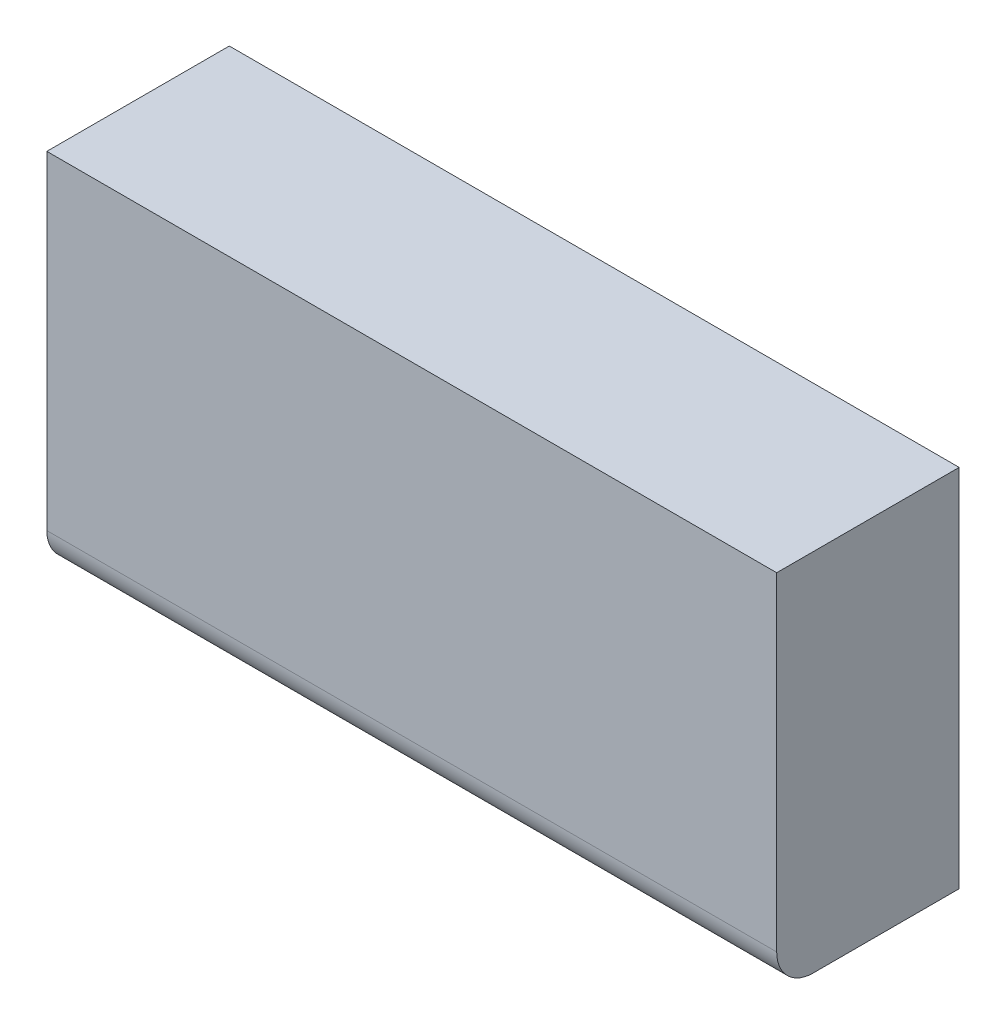
ISO-10303-21;
HEADER;
FILE_DESCRIPTION(('STEP AP214'),'2;1');
FILE_NAME('part.step','',(''),(''),'','','');
FILE_SCHEMA(('AUTOMOTIVE_DESIGN { 1 0 10303 214 1 1 1 1 }'));
ENDSEC;
DATA;
#1=APPLICATION_CONTEXT('core data for automotive mechanical design processes');
#2=APPLICATION_PROTOCOL_DEFINITION('international standard','automotive_design',2000,#1);
#3=PRODUCT_CONTEXT('',#1,'mechanical');
#4=PRODUCT('Part','Part','',(#3));
#5=PRODUCT_RELATED_PRODUCT_CATEGORY('part','',(#4));
#6=PRODUCT_DEFINITION_FORMATION('','',#4);
#7=PRODUCT_DEFINITION_CONTEXT('part definition',#1,'design');
#8=PRODUCT_DEFINITION('design','',#6,#7);
#9=PRODUCT_DEFINITION_SHAPE('','',#8);
#10=(LENGTH_UNIT() NAMED_UNIT(*) SI_UNIT(.MILLI.,.METRE.));
#11=(NAMED_UNIT(*) PLANE_ANGLE_UNIT() SI_UNIT($,.RADIAN.));
#12=(NAMED_UNIT(*) SI_UNIT($,.STERADIAN.) SOLID_ANGLE_UNIT());
#13=UNCERTAINTY_MEASURE_WITH_UNIT(LENGTH_MEASURE(1.E-05),#10,'distance_accuracy_value','');
#14=(GEOMETRIC_REPRESENTATION_CONTEXT(3) GLOBAL_UNCERTAINTY_ASSIGNED_CONTEXT((#13)) GLOBAL_UNIT_ASSIGNED_CONTEXT((#10,
#11,#12)) REPRESENTATION_CONTEXT('',''));
#15=CARTESIAN_POINT('',(0.,0.,0.));
#16=DIRECTION('',(0.,0.,1.));
#17=DIRECTION('',(1.,0.,0.));
#18=AXIS2_PLACEMENT_3D('',#15,#16,#17);
#19=CARTESIAN_POINT('',(0.,20.,10.));
#20=DIRECTION('',(1.,0.,0.));
#21=DIRECTION('',(0.,0.,-1.));
#22=AXIS2_PLACEMENT_3D('',#19,#20,#21);
#23=PLANE('',#22);
#24=DIRECTION('',(0.,0.,-1.));
#25=VECTOR('',#24,1.);
#26=CARTESIAN_POINT('',(0.,0.,10.));
#27=LINE('',#26,#25);
#28=CARTESIAN_POINT('',(0.,0.,8.));
#29=VERTEX_POINT('',#28);
#30=CARTESIAN_POINT('',(0.,0.,0.));
#31=VERTEX_POINT('',#30);
#32=EDGE_CURVE('E123',#29,#31,#27,.T.);
#33=ORIENTED_EDGE('',*,*,#32,.F.);
#34=CARTESIAN_POINT('',(0.,2.,8.));
#35=DIRECTION('',(1.,0.,0.));
#36=DIRECTION('',(0.,0.,-1.));
#37=AXIS2_PLACEMENT_3D('',#34,#35,#36);
#38=CIRCLE('',#37,2.);
#39=CARTESIAN_POINT('',(0.,2.,10.));
#40=VERTEX_POINT('',#39);
#41=EDGE_CURVE('E11',#29,#40,#38,.F.);
#42=ORIENTED_EDGE('',*,*,#41,.T.);
#43=DIRECTION('',(0.,-1.,0.));
#44=VECTOR('',#43,1.);
#45=CARTESIAN_POINT('',(0.,20.,10.));
#46=LINE('',#45,#44);
#47=CARTESIAN_POINT('',(0.,20.,10.));
#48=VERTEX_POINT('',#47);
#49=EDGE_CURVE('E94',#48,#40,#46,.T.);
#50=ORIENTED_EDGE('',*,*,#49,.F.);
#51=DIRECTION('',(0.,0.,-1.));
#52=VECTOR('',#51,1.);
#53=CARTESIAN_POINT('',(0.,20.,10.));
#54=LINE('',#53,#52);
#55=CARTESIAN_POINT('',(0.,20.,0.));
#56=VERTEX_POINT('',#55);
#57=EDGE_CURVE('E104',#48,#56,#54,.T.);
#58=ORIENTED_EDGE('',*,*,#57,.T.);
#59=DIRECTION('',(0.,-1.,0.));
#60=VECTOR('',#59,1.);
#61=CARTESIAN_POINT('',(0.,20.,0.));
#62=LINE('',#61,#60);
#63=EDGE_CURVE('E113',#56,#31,#62,.T.);
#64=ORIENTED_EDGE('',*,*,#63,.T.);
#65=EDGE_LOOP('',(#33,#42,#50,#58,#64));
#66=FACE_BOUND('',#65,.T.);
#67=ADVANCED_FACE('F41',(#66),#23,.F.);
#68=CARTESIAN_POINT('',(0.,0.,10.));
#69=DIRECTION('',(0.,1.,0.));
#70=DIRECTION('',(0.,0.,1.));
#71=AXIS2_PLACEMENT_3D('',#68,#69,#70);
#72=PLANE('',#71);
#73=DIRECTION('',(0.,0.,-1.));
#74=VECTOR('',#73,1.);
#75=CARTESIAN_POINT('',(40.,0.,10.));
#76=LINE('',#75,#74);
#77=CARTESIAN_POINT('',(40.,0.,8.));
#78=VERTEX_POINT('',#77);
#79=CARTESIAN_POINT('',(40.,0.,0.));
#80=VERTEX_POINT('',#79);
#81=EDGE_CURVE('E103',#78,#80,#76,.T.);
#82=ORIENTED_EDGE('',*,*,#81,.F.);
#83=DIRECTION('',(1.,0.,0.));
#84=VECTOR('',#83,1.);
#85=CARTESIAN_POINT('',(0.,0.,8.));
#86=LINE('',#85,#84);
#87=EDGE_CURVE('E49',#78,#29,#86,.F.);
#88=ORIENTED_EDGE('',*,*,#87,.T.);
#89=ORIENTED_EDGE('',*,*,#32,.T.);
#90=DIRECTION('',(1.,0.,0.));
#91=VECTOR('',#90,1.);
#92=CARTESIAN_POINT('',(0.,0.,0.));
#93=LINE('',#92,#91);
#94=EDGE_CURVE('E116',#31,#80,#93,.T.);
#95=ORIENTED_EDGE('',*,*,#94,.T.);
#96=EDGE_LOOP('',(#82,#88,#89,#95));
#97=FACE_BOUND('',#96,.T.);
#98=ADVANCED_FACE('F127',(#97),#72,.F.);
#99=CARTESIAN_POINT('',(40.,0.,10.));
#100=DIRECTION('',(-1.,0.,0.));
#101=DIRECTION('',(0.,0.,1.));
#102=AXIS2_PLACEMENT_3D('',#99,#100,#101);
#103=PLANE('',#102);
#104=DIRECTION('',(0.,1.,0.));
#105=VECTOR('',#104,1.);
#106=CARTESIAN_POINT('',(40.,0.,10.));
#107=LINE('',#106,#105);
#108=CARTESIAN_POINT('',(40.,2.,10.));
#109=VERTEX_POINT('',#108);
#110=CARTESIAN_POINT('',(40.,20.,10.));
#111=VERTEX_POINT('',#110);
#112=EDGE_CURVE('E85',#109,#111,#107,.T.);
#113=ORIENTED_EDGE('',*,*,#112,.F.);
#114=CARTESIAN_POINT('',(40.,2.,8.));
#115=DIRECTION('',(-1.,0.,0.));
#116=DIRECTION('',(0.,0.,1.));
#117=AXIS2_PLACEMENT_3D('',#114,#115,#116);
#118=CIRCLE('',#117,2.);
#119=EDGE_CURVE('E63',#109,#78,#118,.F.);
#120=ORIENTED_EDGE('',*,*,#119,.T.);
#121=ORIENTED_EDGE('',*,*,#81,.T.);
#122=DIRECTION('',(0.,1.,0.));
#123=VECTOR('',#122,1.);
#124=CARTESIAN_POINT('',(40.,0.,0.));
#125=LINE('',#124,#123);
#126=CARTESIAN_POINT('',(40.,20.,0.));
#127=VERTEX_POINT('',#126);
#128=EDGE_CURVE('E100',#80,#127,#125,.T.);
#129=ORIENTED_EDGE('',*,*,#128,.T.);
#130=DIRECTION('',(0.,0.,-1.));
#131=VECTOR('',#130,1.);
#132=CARTESIAN_POINT('',(40.,20.,10.));
#133=LINE('',#132,#131);
#134=EDGE_CURVE('E97',#111,#127,#133,.T.);
#135=ORIENTED_EDGE('',*,*,#134,.F.);
#136=EDGE_LOOP('',(#113,#120,#121,#129,#135));
#137=FACE_BOUND('',#136,.T.);
#138=ADVANCED_FACE('F98',(#137),#103,.F.);
#139=CARTESIAN_POINT('',(40.,20.,10.));
#140=DIRECTION('',(0.,-1.,0.));
#141=DIRECTION('',(0.,0.,-1.));
#142=AXIS2_PLACEMENT_3D('',#139,#140,#141);
#143=PLANE('',#142);
#144=DIRECTION('',(-1.,0.,0.));
#145=VECTOR('',#144,1.);
#146=CARTESIAN_POINT('',(40.,20.,0.));
#147=LINE('',#146,#145);
#148=EDGE_CURVE('E120',#127,#56,#147,.T.);
#149=ORIENTED_EDGE('',*,*,#148,.T.);
#150=ORIENTED_EDGE('',*,*,#57,.F.);
#151=DIRECTION('',(-1.,0.,0.));
#152=VECTOR('',#151,1.);
#153=CARTESIAN_POINT('',(40.,20.,10.));
#154=LINE('',#153,#152);
#155=EDGE_CURVE('E90',#111,#48,#154,.T.);
#156=ORIENTED_EDGE('',*,*,#155,.F.);
#157=ORIENTED_EDGE('',*,*,#134,.T.);
#158=EDGE_LOOP('',(#149,#150,#156,#157));
#159=FACE_BOUND('',#158,.T.);
#160=ADVANCED_FACE('F106',(#159),#143,.F.);
#161=CARTESIAN_POINT('',(0.,0.,10.));
#162=DIRECTION('',(0.,0.,1.));
#163=DIRECTION('',(1.,0.,0.));
#164=AXIS2_PLACEMENT_3D('',#161,#162,#163);
#165=PLANE('',#164);
#166=ORIENTED_EDGE('',*,*,#49,.T.);
#167=DIRECTION('',(1.,0.,0.));
#168=VECTOR('',#167,1.);
#169=CARTESIAN_POINT('',(40.,2.,10.));
#170=LINE('',#169,#168);
#171=EDGE_CURVE('E93',#40,#109,#170,.T.);
#172=ORIENTED_EDGE('',*,*,#171,.T.);
#173=ORIENTED_EDGE('',*,*,#112,.T.);
#174=ORIENTED_EDGE('',*,*,#155,.T.);
#175=EDGE_LOOP('',(#166,#172,#173,#174));
#176=FACE_BOUND('',#175,.T.);
#177=ADVANCED_FACE('F88',(#176),#165,.T.);
#178=CARTESIAN_POINT('',(0.,0.,0.));
#179=DIRECTION('',(0.,0.,1.));
#180=DIRECTION('',(1.,0.,0.));
#181=AXIS2_PLACEMENT_3D('',#178,#179,#180);
#182=PLANE('',#181);
#183=ORIENTED_EDGE('',*,*,#63,.F.);
#184=ORIENTED_EDGE('',*,*,#148,.F.);
#185=ORIENTED_EDGE('',*,*,#128,.F.);
#186=ORIENTED_EDGE('',*,*,#94,.F.);
#187=EDGE_LOOP('',(#183,#184,#185,#186));
#188=FACE_BOUND('',#187,.T.);
#189=ADVANCED_FACE('F132',(#188),#182,.F.);
#190=CARTESIAN_POINT('',(0.,2.,8.));
#191=DIRECTION('',(-1.,0.,0.));
#192=DIRECTION('',(0.,0.,1.));
#193=AXIS2_PLACEMENT_3D('',#190,#191,#192);
#194=CYLINDRICAL_SURFACE('',#193,2.);
#195=ORIENTED_EDGE('',*,*,#41,.F.);
#196=ORIENTED_EDGE('',*,*,#87,.F.);
#197=ORIENTED_EDGE('',*,*,#119,.F.);
#198=ORIENTED_EDGE('',*,*,#171,.F.);
#199=EDGE_LOOP('',(#195,#196,#197,#198));
#200=FACE_BOUND('',#199,.T.);
#201=ADVANCED_FACE('F43',(#200),#194,.T.);
#202=CLOSED_SHELL('',(#67,#98,#138,#160,#177,#189,#201));
#203=MANIFOLD_SOLID_BREP('B2',#202);
#204=ADVANCED_BREP_SHAPE_REPRESENTATION('',(#18,#203),#14);
#205=SHAPE_DEFINITION_REPRESENTATION(#9,#204);
ENDSEC;
END-ISO-10303-21;
